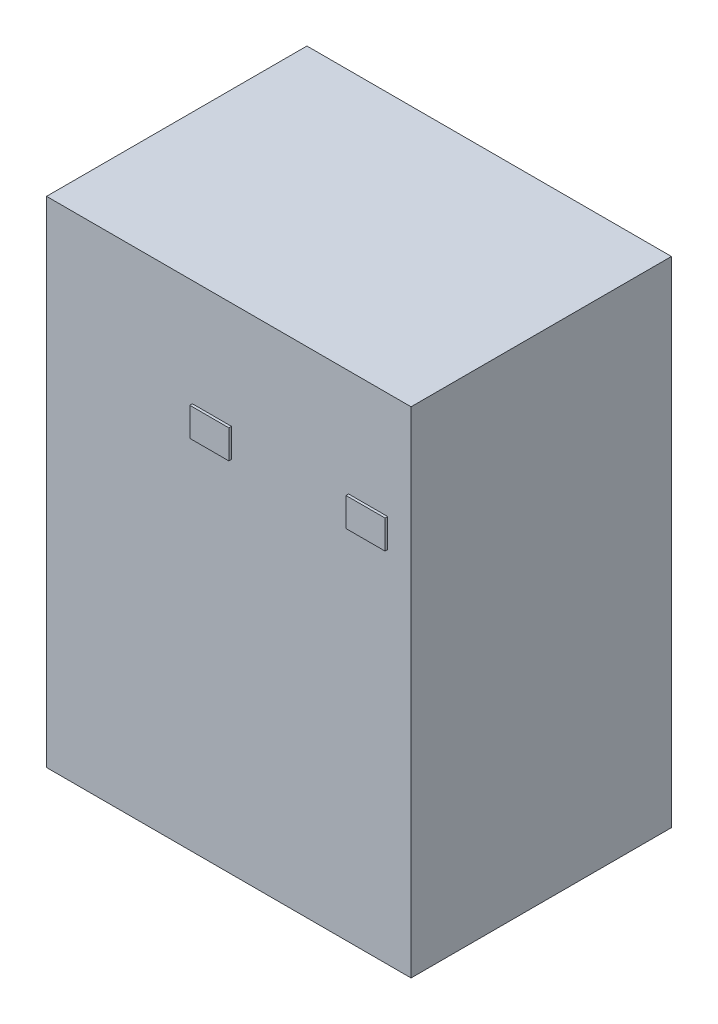
ISO-10303-21;
HEADER;
FILE_DESCRIPTION(('STEP AP214'),'2;1');
FILE_NAME('part.step','',(''),(''),'','','');
FILE_SCHEMA(('AUTOMOTIVE_DESIGN { 1 0 10303 214 1 1 1 1 }'));
ENDSEC;
DATA;
#1=APPLICATION_CONTEXT('core data for automotive mechanical design processes');
#2=APPLICATION_PROTOCOL_DEFINITION('international standard','automotive_design',2000,#1);
#3=PRODUCT_CONTEXT('',#1,'mechanical');
#4=PRODUCT('Part','Part','',(#3));
#5=PRODUCT_RELATED_PRODUCT_CATEGORY('part','',(#4));
#6=PRODUCT_DEFINITION_FORMATION('','',#4);
#7=PRODUCT_DEFINITION_CONTEXT('part definition',#1,'design');
#8=PRODUCT_DEFINITION('design','',#6,#7);
#9=PRODUCT_DEFINITION_SHAPE('','',#8);
#10=(LENGTH_UNIT() NAMED_UNIT(*) SI_UNIT(.MILLI.,.METRE.));
#11=(NAMED_UNIT(*) PLANE_ANGLE_UNIT() SI_UNIT($,.RADIAN.));
#12=(NAMED_UNIT(*) SI_UNIT($,.STERADIAN.) SOLID_ANGLE_UNIT());
#13=UNCERTAINTY_MEASURE_WITH_UNIT(LENGTH_MEASURE(1.E-05),#10,'distance_accuracy_value','');
#14=(GEOMETRIC_REPRESENTATION_CONTEXT(3) GLOBAL_UNCERTAINTY_ASSIGNED_CONTEXT((#13)) GLOBAL_UNIT_ASSIGNED_CONTEXT((#10,
#11,#12)) REPRESENTATION_CONTEXT('',''));
#15=CARTESIAN_POINT('',(0.,0.,0.));
#16=DIRECTION('',(0.,0.,1.));
#17=DIRECTION('',(1.,0.,0.));
#18=AXIS2_PLACEMENT_3D('',#15,#16,#17);
#19=CARTESIAN_POINT('',(0.,0.,100.));
#20=DIRECTION('',(0.,0.,1.));
#21=DIRECTION('',(1.,0.,0.));
#22=AXIS2_PLACEMENT_3D('',#19,#20,#21);
#23=PLANE('',#22);
#24=DIRECTION('',(0.,-1.,0.));
#25=VECTOR('',#24,1.);
#26=CARTESIAN_POINT('',(0.,0.,100.));
#27=LINE('',#26,#25);
#28=CARTESIAN_POINT('',(0.,0.,100.));
#29=VERTEX_POINT('',#28);
#30=CARTESIAN_POINT('',(0.,-190.,100.));
#31=VERTEX_POINT('',#30);
#32=EDGE_CURVE('E180',#29,#31,#27,.T.);
#33=ORIENTED_EDGE('',*,*,#32,.T.);
#34=DIRECTION('',(1.,0.,0.));
#35=VECTOR('',#34,1.);
#36=CARTESIAN_POINT('',(0.,-190.,100.));
#37=LINE('',#36,#35);
#38=CARTESIAN_POINT('',(140.,-190.,100.));
#39=VERTEX_POINT('',#38);
#40=EDGE_CURVE('E183',#31,#39,#37,.T.);
#41=ORIENTED_EDGE('',*,*,#40,.T.);
#42=DIRECTION('',(0.,1.,0.));
#43=VECTOR('',#42,1.);
#44=CARTESIAN_POINT('',(140.,0.,100.));
#45=LINE('',#44,#43);
#46=CARTESIAN_POINT('',(140.,0.,100.));
#47=VERTEX_POINT('',#46);
#48=EDGE_CURVE('E186',#39,#47,#45,.T.);
#49=ORIENTED_EDGE('',*,*,#48,.T.);
#50=DIRECTION('',(-1.,0.,0.));
#51=VECTOR('',#50,1.);
#52=CARTESIAN_POINT('',(0.,0.,100.));
#53=LINE('',#52,#51);
#54=EDGE_CURVE('E188',#47,#29,#53,.T.);
#55=ORIENTED_EDGE('',*,*,#54,.T.);
#56=EDGE_LOOP('',(#33,#41,#49,#55));
#57=FACE_BOUND('',#56,.T.);
#58=DIRECTION('',(1.,0.,0.));
#59=VECTOR('',#58,1.);
#60=CARTESIAN_POINT('',(116.,-52.,100.));
#61=LINE('',#60,#59);
#62=CARTESIAN_POINT('',(116.,-52.,100.));
#63=VERTEX_POINT('',#62);
#64=CARTESIAN_POINT('',(131.,-52.,100.));
#65=VERTEX_POINT('',#64);
#66=EDGE_CURVE('E151',#63,#65,#61,.T.);
#67=ORIENTED_EDGE('',*,*,#66,.F.);
#68=DIRECTION('',(0.,-1.,0.));
#69=VECTOR('',#68,1.);
#70=CARTESIAN_POINT('',(116.,-41.,100.));
#71=LINE('',#70,#69);
#72=CARTESIAN_POINT('',(116.,-41.,100.));
#73=VERTEX_POINT('',#72);
#74=EDGE_CURVE('E148',#73,#63,#71,.T.);
#75=ORIENTED_EDGE('',*,*,#74,.F.);
#76=DIRECTION('',(-1.,0.,0.));
#77=VECTOR('',#76,1.);
#78=CARTESIAN_POINT('',(116.,-41.,100.));
#79=LINE('',#78,#77);
#80=CARTESIAN_POINT('',(131.,-41.,100.));
#81=VERTEX_POINT('',#80);
#82=EDGE_CURVE('E160',#81,#73,#79,.T.);
#83=ORIENTED_EDGE('',*,*,#82,.F.);
#84=DIRECTION('',(0.,1.,0.));
#85=VECTOR('',#84,1.);
#86=CARTESIAN_POINT('',(131.,-41.,100.));
#87=LINE('',#86,#85);
#88=EDGE_CURVE('E168',#65,#81,#87,.T.);
#89=ORIENTED_EDGE('',*,*,#88,.F.);
#90=EDGE_LOOP('',(#67,#75,#83,#89));
#91=FACE_BOUND('',#90,.T.);
#92=DIRECTION('',(1.,0.,0.));
#93=VECTOR('',#92,1.);
#94=CARTESIAN_POINT('',(56.,-52.,100.));
#95=LINE('',#94,#93);
#96=CARTESIAN_POINT('',(56.,-52.,100.));
#97=VERTEX_POINT('',#96);
#98=CARTESIAN_POINT('',(71.,-52.,100.));
#99=VERTEX_POINT('',#98);
#100=EDGE_CURVE('E369',#97,#99,#95,.T.);
#101=ORIENTED_EDGE('',*,*,#100,.F.);
#102=DIRECTION('',(0.,-1.,0.));
#103=VECTOR('',#102,1.);
#104=CARTESIAN_POINT('',(56.,-41.,100.));
#105=LINE('',#104,#103);
#106=CARTESIAN_POINT('',(56.,-41.,100.));
#107=VERTEX_POINT('',#106);
#108=EDGE_CURVE('E146',#107,#97,#105,.T.);
#109=ORIENTED_EDGE('',*,*,#108,.F.);
#110=DIRECTION('',(-1.,0.,0.));
#111=VECTOR('',#110,1.);
#112=CARTESIAN_POINT('',(56.,-41.,100.));
#113=LINE('',#112,#111);
#114=CARTESIAN_POINT('',(71.,-41.,100.));
#115=VERTEX_POINT('',#114);
#116=EDGE_CURVE('E142',#115,#107,#113,.T.);
#117=ORIENTED_EDGE('',*,*,#116,.F.);
#118=DIRECTION('',(0.,1.,0.));
#119=VECTOR('',#118,1.);
#120=CARTESIAN_POINT('',(71.,-41.,100.));
#121=LINE('',#120,#119);
#122=EDGE_CURVE('E366',#99,#115,#121,.T.);
#123=ORIENTED_EDGE('',*,*,#122,.F.);
#124=EDGE_LOOP('',(#101,#109,#117,#123));
#125=FACE_BOUND('',#124,.T.);
#126=ADVANCED_FACE('F33',(#57,#91,#125),#23,.T.);
#127=CARTESIAN_POINT('',(0.,0.,100.));
#128=DIRECTION('',(1.,0.,0.));
#129=DIRECTION('',(0.,1.,0.));
#130=AXIS2_PLACEMENT_3D('',#127,#128,#129);
#131=PLANE('',#130);
#132=DIRECTION('',(0.,-1.,0.));
#133=VECTOR('',#132,1.);
#134=CARTESIAN_POINT('',(0.,0.,0.));
#135=LINE('',#134,#133);
#136=CARTESIAN_POINT('',(0.,0.,0.));
#137=VERTEX_POINT('',#136);
#138=CARTESIAN_POINT('',(0.,-190.,0.));
#139=VERTEX_POINT('',#138);
#140=EDGE_CURVE('E179',#137,#139,#135,.T.);
#141=ORIENTED_EDGE('',*,*,#140,.T.);
#142=DIRECTION('',(0.,0.,-1.));
#143=VECTOR('',#142,1.);
#144=CARTESIAN_POINT('',(0.,-190.,100.));
#145=LINE('',#144,#143);
#146=EDGE_CURVE('E11',#31,#139,#145,.T.);
#147=ORIENTED_EDGE('',*,*,#146,.F.);
#148=ORIENTED_EDGE('',*,*,#32,.F.);
#149=DIRECTION('',(0.,0.,-1.));
#150=VECTOR('',#149,1.);
#151=CARTESIAN_POINT('',(0.,0.,100.));
#152=LINE('',#151,#150);
#153=EDGE_CURVE('E190',#29,#137,#152,.T.);
#154=ORIENTED_EDGE('',*,*,#153,.T.);
#155=EDGE_LOOP('',(#141,#147,#148,#154));
#156=FACE_BOUND('',#155,.T.);
#157=ADVANCED_FACE('F35',(#156),#131,.F.);
#158=CARTESIAN_POINT('',(0.,-190.,100.));
#159=DIRECTION('',(0.,1.,0.));
#160=DIRECTION('',(0.,0.,1.));
#161=AXIS2_PLACEMENT_3D('',#158,#159,#160);
#162=PLANE('',#161);
#163=DIRECTION('',(1.,0.,0.));
#164=VECTOR('',#163,1.);
#165=CARTESIAN_POINT('',(0.,-190.,0.));
#166=LINE('',#165,#164);
#167=CARTESIAN_POINT('',(140.,-190.,0.));
#168=VERTEX_POINT('',#167);
#169=EDGE_CURVE('E193',#139,#168,#166,.T.);
#170=ORIENTED_EDGE('',*,*,#169,.T.);
#171=DIRECTION('',(0.,0.,-1.));
#172=VECTOR('',#171,1.);
#173=CARTESIAN_POINT('',(140.,-190.,100.));
#174=LINE('',#173,#172);
#175=EDGE_CURVE('E41',#39,#168,#174,.T.);
#176=ORIENTED_EDGE('',*,*,#175,.F.);
#177=ORIENTED_EDGE('',*,*,#40,.F.);
#178=ORIENTED_EDGE('',*,*,#146,.T.);
#179=EDGE_LOOP('',(#170,#176,#177,#178));
#180=FACE_BOUND('',#179,.T.);
#181=ADVANCED_FACE('F223',(#180),#162,.F.);
#182=CARTESIAN_POINT('',(140.,0.,100.));
#183=DIRECTION('',(-1.,0.,0.));
#184=DIRECTION('',(0.,-1.,0.));
#185=AXIS2_PLACEMENT_3D('',#182,#183,#184);
#186=PLANE('',#185);
#187=DIRECTION('',(0.,1.,0.));
#188=VECTOR('',#187,1.);
#189=CARTESIAN_POINT('',(140.,0.,0.));
#190=LINE('',#189,#188);
#191=CARTESIAN_POINT('',(140.,0.,0.));
#192=VERTEX_POINT('',#191);
#193=EDGE_CURVE('E195',#168,#192,#190,.T.);
#194=ORIENTED_EDGE('',*,*,#193,.T.);
#195=DIRECTION('',(0.,0.,-1.));
#196=VECTOR('',#195,1.);
#197=CARTESIAN_POINT('',(140.,0.,100.));
#198=LINE('',#197,#196);
#199=EDGE_CURVE('E200',#47,#192,#198,.T.);
#200=ORIENTED_EDGE('',*,*,#199,.F.);
#201=ORIENTED_EDGE('',*,*,#48,.F.);
#202=ORIENTED_EDGE('',*,*,#175,.T.);
#203=EDGE_LOOP('',(#194,#200,#201,#202));
#204=FACE_BOUND('',#203,.T.);
#205=ADVANCED_FACE('F207',(#204),#186,.F.);
#206=CARTESIAN_POINT('',(0.,0.,100.));
#207=DIRECTION('',(0.,-1.,0.));
#208=DIRECTION('',(0.,0.,-1.));
#209=AXIS2_PLACEMENT_3D('',#206,#207,#208);
#210=PLANE('',#209);
#211=DIRECTION('',(-1.,0.,0.));
#212=VECTOR('',#211,1.);
#213=CARTESIAN_POINT('',(0.,0.,0.));
#214=LINE('',#213,#212);
#215=EDGE_CURVE('E184',#192,#137,#214,.T.);
#216=ORIENTED_EDGE('',*,*,#215,.T.);
#217=ORIENTED_EDGE('',*,*,#153,.F.);
#218=ORIENTED_EDGE('',*,*,#54,.F.);
#219=ORIENTED_EDGE('',*,*,#199,.T.);
#220=EDGE_LOOP('',(#216,#217,#218,#219));
#221=FACE_BOUND('',#220,.T.);
#222=ADVANCED_FACE('F216',(#221),#210,.F.);
#223=CARTESIAN_POINT('',(0.,0.,0.));
#224=DIRECTION('',(0.,0.,1.));
#225=DIRECTION('',(1.,0.,0.));
#226=AXIS2_PLACEMENT_3D('',#223,#224,#225);
#227=PLANE('',#226);
#228=ORIENTED_EDGE('',*,*,#140,.F.);
#229=ORIENTED_EDGE('',*,*,#215,.F.);
#230=ORIENTED_EDGE('',*,*,#193,.F.);
#231=ORIENTED_EDGE('',*,*,#169,.F.);
#232=EDGE_LOOP('',(#228,#229,#230,#231));
#233=FACE_BOUND('',#232,.T.);
#234=ADVANCED_FACE('F213',(#233),#227,.F.);
#235=CARTESIAN_POINT('',(116.,-41.,101.));
#236=DIRECTION('',(1.,0.,0.));
#237=DIRECTION('',(0.,1.,0.));
#238=AXIS2_PLACEMENT_3D('',#235,#236,#237);
#239=PLANE('',#238);
#240=ORIENTED_EDGE('',*,*,#74,.T.);
#241=DIRECTION('',(0.,0.,-1.));
#242=VECTOR('',#241,1.);
#243=CARTESIAN_POINT('',(116.,-52.,101.));
#244=LINE('',#243,#242);
#245=CARTESIAN_POINT('',(116.,-52.,101.));
#246=VERTEX_POINT('',#245);
#247=EDGE_CURVE('E177',#246,#63,#244,.T.);
#248=ORIENTED_EDGE('',*,*,#247,.F.);
#249=DIRECTION('',(0.,-1.,0.));
#250=VECTOR('',#249,1.);
#251=CARTESIAN_POINT('',(116.,-41.,101.));
#252=LINE('',#251,#250);
#253=CARTESIAN_POINT('',(116.,-41.,101.));
#254=VERTEX_POINT('',#253);
#255=EDGE_CURVE('E156',#254,#246,#252,.T.);
#256=ORIENTED_EDGE('',*,*,#255,.F.);
#257=DIRECTION('',(0.,0.,-1.));
#258=VECTOR('',#257,1.);
#259=CARTESIAN_POINT('',(116.,-41.,101.));
#260=LINE('',#259,#258);
#261=EDGE_CURVE('E165',#254,#73,#260,.T.);
#262=ORIENTED_EDGE('',*,*,#261,.T.);
#263=EDGE_LOOP('',(#240,#248,#256,#262));
#264=FACE_BOUND('',#263,.T.);
#265=ADVANCED_FACE('F236',(#264),#239,.F.);
#266=CARTESIAN_POINT('',(116.,-52.,101.));
#267=DIRECTION('',(0.,1.,0.));
#268=DIRECTION('',(0.,0.,1.));
#269=AXIS2_PLACEMENT_3D('',#266,#267,#268);
#270=PLANE('',#269);
#271=ORIENTED_EDGE('',*,*,#66,.T.);
#272=DIRECTION('',(0.,0.,-1.));
#273=VECTOR('',#272,1.);
#274=CARTESIAN_POINT('',(131.,-52.,101.));
#275=LINE('',#274,#273);
#276=CARTESIAN_POINT('',(131.,-52.,101.));
#277=VERTEX_POINT('',#276);
#278=EDGE_CURVE('E174',#277,#65,#275,.T.);
#279=ORIENTED_EDGE('',*,*,#278,.F.);
#280=DIRECTION('',(1.,0.,0.));
#281=VECTOR('',#280,1.);
#282=CARTESIAN_POINT('',(116.,-52.,101.));
#283=LINE('',#282,#281);
#284=EDGE_CURVE('E159',#246,#277,#283,.T.);
#285=ORIENTED_EDGE('',*,*,#284,.F.);
#286=ORIENTED_EDGE('',*,*,#247,.T.);
#287=EDGE_LOOP('',(#271,#279,#285,#286));
#288=FACE_BOUND('',#287,.T.);
#289=ADVANCED_FACE('F255',(#288),#270,.F.);
#290=CARTESIAN_POINT('',(131.,-41.,101.));
#291=DIRECTION('',(-1.,0.,0.));
#292=DIRECTION('',(0.,-1.,0.));
#293=AXIS2_PLACEMENT_3D('',#290,#291,#292);
#294=PLANE('',#293);
#295=ORIENTED_EDGE('',*,*,#88,.T.);
#296=DIRECTION('',(0.,0.,-1.));
#297=VECTOR('',#296,1.);
#298=CARTESIAN_POINT('',(131.,-41.,101.));
#299=LINE('',#298,#297);
#300=CARTESIAN_POINT('',(131.,-41.,101.));
#301=VERTEX_POINT('',#300);
#302=EDGE_CURVE('E56',#301,#81,#299,.T.);
#303=ORIENTED_EDGE('',*,*,#302,.F.);
#304=DIRECTION('',(0.,1.,0.));
#305=VECTOR('',#304,1.);
#306=CARTESIAN_POINT('',(131.,-41.,101.));
#307=LINE('',#306,#305);
#308=EDGE_CURVE('E162',#277,#301,#307,.T.);
#309=ORIENTED_EDGE('',*,*,#308,.F.);
#310=ORIENTED_EDGE('',*,*,#278,.T.);
#311=EDGE_LOOP('',(#295,#303,#309,#310));
#312=FACE_BOUND('',#311,.T.);
#313=ADVANCED_FACE('F262',(#312),#294,.F.);
#314=CARTESIAN_POINT('',(116.,-41.,101.));
#315=DIRECTION('',(0.,-1.,0.));
#316=DIRECTION('',(1.,0.,0.));
#317=AXIS2_PLACEMENT_3D('',#314,#315,#316);
#318=PLANE('',#317);
#319=ORIENTED_EDGE('',*,*,#82,.T.);
#320=ORIENTED_EDGE('',*,*,#261,.F.);
#321=DIRECTION('',(-1.,0.,0.));
#322=VECTOR('',#321,1.);
#323=CARTESIAN_POINT('',(116.,-41.,101.));
#324=LINE('',#323,#322);
#325=EDGE_CURVE('E164',#301,#254,#324,.T.);
#326=ORIENTED_EDGE('',*,*,#325,.F.);
#327=ORIENTED_EDGE('',*,*,#302,.T.);
#328=EDGE_LOOP('',(#319,#320,#326,#327));
#329=FACE_BOUND('',#328,.T.);
#330=ADVANCED_FACE('F269',(#329),#318,.F.);
#331=CARTESIAN_POINT('',(0.,0.,101.));
#332=DIRECTION('',(0.,0.,1.));
#333=DIRECTION('',(1.,0.,0.));
#334=AXIS2_PLACEMENT_3D('',#331,#332,#333);
#335=PLANE('',#334);
#336=ORIENTED_EDGE('',*,*,#255,.T.);
#337=ORIENTED_EDGE('',*,*,#284,.T.);
#338=ORIENTED_EDGE('',*,*,#308,.T.);
#339=ORIENTED_EDGE('',*,*,#325,.T.);
#340=EDGE_LOOP('',(#336,#337,#338,#339));
#341=FACE_BOUND('',#340,.T.);
#342=ADVANCED_FACE('F277',(#341),#335,.T.);
#343=CARTESIAN_POINT('',(56.,-41.,101.));
#344=DIRECTION('',(1.,0.,0.));
#345=DIRECTION('',(0.,1.,0.));
#346=AXIS2_PLACEMENT_3D('',#343,#344,#345);
#347=PLANE('',#346);
#348=ORIENTED_EDGE('',*,*,#108,.T.);
#349=DIRECTION('',(0.,0.,-1.));
#350=VECTOR('',#349,1.);
#351=CARTESIAN_POINT('',(56.,-52.,101.));
#352=LINE('',#351,#350);
#353=CARTESIAN_POINT('',(56.,-52.,101.));
#354=VERTEX_POINT('',#353);
#355=EDGE_CURVE('E127',#354,#97,#352,.T.);
#356=ORIENTED_EDGE('',*,*,#355,.F.);
#357=DIRECTION('',(0.,-1.,0.));
#358=VECTOR('',#357,1.);
#359=CARTESIAN_POINT('',(56.,-41.,101.));
#360=LINE('',#359,#358);
#361=CARTESIAN_POINT('',(56.,-41.,101.));
#362=VERTEX_POINT('',#361);
#363=EDGE_CURVE('E134',#362,#354,#360,.T.);
#364=ORIENTED_EDGE('',*,*,#363,.F.);
#365=DIRECTION('',(0.,0.,-1.));
#366=VECTOR('',#365,1.);
#367=CARTESIAN_POINT('',(56.,-41.,101.));
#368=LINE('',#367,#366);
#369=EDGE_CURVE('E363',#362,#107,#368,.T.);
#370=ORIENTED_EDGE('',*,*,#369,.T.);
#371=EDGE_LOOP('',(#348,#356,#364,#370));
#372=FACE_BOUND('',#371,.T.);
#373=ADVANCED_FACE('F144',(#372),#347,.F.);
#374=CARTESIAN_POINT('',(56.,-52.,101.));
#375=DIRECTION('',(0.,1.,0.));
#376=DIRECTION('',(-1.,0.,0.));
#377=AXIS2_PLACEMENT_3D('',#374,#375,#376);
#378=PLANE('',#377);
#379=ORIENTED_EDGE('',*,*,#100,.T.);
#380=DIRECTION('',(0.,0.,-1.));
#381=VECTOR('',#380,1.);
#382=CARTESIAN_POINT('',(71.,-52.,101.));
#383=LINE('',#382,#381);
#384=CARTESIAN_POINT('',(71.,-52.,101.));
#385=VERTEX_POINT('',#384);
#386=EDGE_CURVE('E130',#385,#99,#383,.T.);
#387=ORIENTED_EDGE('',*,*,#386,.F.);
#388=DIRECTION('',(1.,0.,0.));
#389=VECTOR('',#388,1.);
#390=CARTESIAN_POINT('',(56.,-52.,101.));
#391=LINE('',#390,#389);
#392=EDGE_CURVE('E123',#354,#385,#391,.T.);
#393=ORIENTED_EDGE('',*,*,#392,.F.);
#394=ORIENTED_EDGE('',*,*,#355,.T.);
#395=EDGE_LOOP('',(#379,#387,#393,#394));
#396=FACE_BOUND('',#395,.T.);
#397=ADVANCED_FACE('F125',(#396),#378,.F.);
#398=CARTESIAN_POINT('',(71.,-41.,101.));
#399=DIRECTION('',(-1.,0.,0.));
#400=DIRECTION('',(0.,0.,1.));
#401=AXIS2_PLACEMENT_3D('',#398,#399,#400);
#402=PLANE('',#401);
#403=ORIENTED_EDGE('',*,*,#122,.T.);
#404=DIRECTION('',(0.,0.,-1.));
#405=VECTOR('',#404,1.);
#406=CARTESIAN_POINT('',(71.,-41.,101.));
#407=LINE('',#406,#405);
#408=CARTESIAN_POINT('',(71.,-41.,101.));
#409=VERTEX_POINT('',#408);
#410=EDGE_CURVE('E48',#409,#115,#407,.T.);
#411=ORIENTED_EDGE('',*,*,#410,.F.);
#412=DIRECTION('',(0.,1.,0.));
#413=VECTOR('',#412,1.);
#414=CARTESIAN_POINT('',(71.,-41.,101.));
#415=LINE('',#414,#413);
#416=EDGE_CURVE('E133',#385,#409,#415,.T.);
#417=ORIENTED_EDGE('',*,*,#416,.F.);
#418=ORIENTED_EDGE('',*,*,#386,.T.);
#419=EDGE_LOOP('',(#403,#411,#417,#418));
#420=FACE_BOUND('',#419,.T.);
#421=ADVANCED_FACE('F297',(#420),#402,.F.);
#422=CARTESIAN_POINT('',(56.,-41.,101.));
#423=DIRECTION('',(0.,-1.,0.));
#424=DIRECTION('',(1.,0.,0.));
#425=AXIS2_PLACEMENT_3D('',#422,#423,#424);
#426=PLANE('',#425);
#427=ORIENTED_EDGE('',*,*,#116,.T.);
#428=ORIENTED_EDGE('',*,*,#369,.F.);
#429=DIRECTION('',(-1.,0.,0.));
#430=VECTOR('',#429,1.);
#431=CARTESIAN_POINT('',(56.,-41.,101.));
#432=LINE('',#431,#430);
#433=EDGE_CURVE('E138',#409,#362,#432,.T.);
#434=ORIENTED_EDGE('',*,*,#433,.F.);
#435=ORIENTED_EDGE('',*,*,#410,.T.);
#436=EDGE_LOOP('',(#427,#428,#434,#435));
#437=FACE_BOUND('',#436,.T.);
#438=ADVANCED_FACE('F304',(#437),#426,.F.);
#439=CARTESIAN_POINT('',(0.,0.,101.));
#440=DIRECTION('',(0.,0.,1.));
#441=DIRECTION('',(1.,0.,0.));
#442=AXIS2_PLACEMENT_3D('',#439,#440,#441);
#443=PLANE('',#442);
#444=ORIENTED_EDGE('',*,*,#363,.T.);
#445=ORIENTED_EDGE('',*,*,#392,.T.);
#446=ORIENTED_EDGE('',*,*,#416,.T.);
#447=ORIENTED_EDGE('',*,*,#433,.T.);
#448=EDGE_LOOP('',(#444,#445,#446,#447));
#449=FACE_BOUND('',#448,.T.);
#450=ADVANCED_FACE('F137',(#449),#443,.T.);
#451=CLOSED_SHELL('',(#126,#157,#181,#205,#222,#234,#265,#289,#313,#330,#342,#373,#397,#421,
#438,#450));
#452=MANIFOLD_SOLID_BREP('B2',#451);
#453=ADVANCED_BREP_SHAPE_REPRESENTATION('',(#18,#452),#14);
#454=SHAPE_DEFINITION_REPRESENTATION(#9,#453);
ENDSEC;
END-ISO-10303-21;
